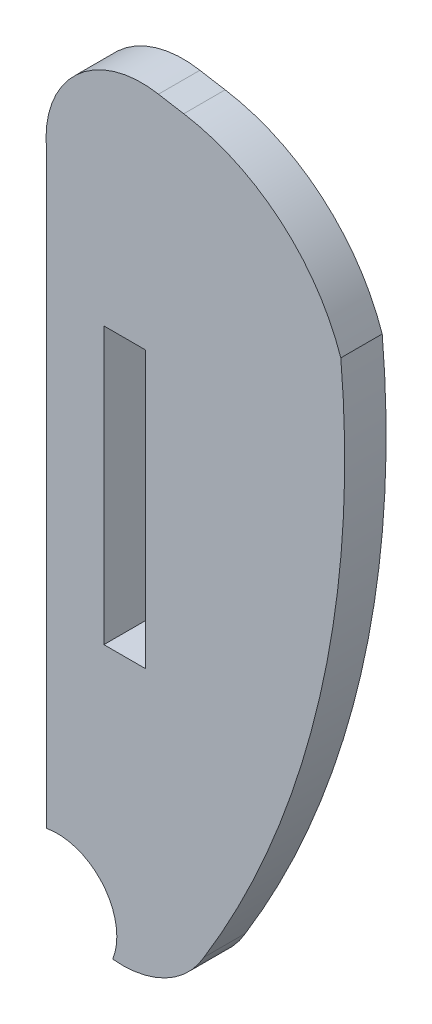
ISO-10303-21;
HEADER;
FILE_DESCRIPTION(('STEP AP214'),'2;1');
FILE_NAME('part.step','',(''),(''),'','','');
FILE_SCHEMA(('AUTOMOTIVE_DESIGN { 1 0 10303 214 1 1 1 1 }'));
ENDSEC;
DATA;
#1=APPLICATION_CONTEXT('core data for automotive mechanical design processes');
#2=APPLICATION_PROTOCOL_DEFINITION('international standard','automotive_design',2000,#1);
#3=PRODUCT_CONTEXT('',#1,'mechanical');
#4=PRODUCT('Part','Part','',(#3));
#5=PRODUCT_RELATED_PRODUCT_CATEGORY('part','',(#4));
#6=PRODUCT_DEFINITION_FORMATION('','',#4);
#7=PRODUCT_DEFINITION_CONTEXT('part definition',#1,'design');
#8=PRODUCT_DEFINITION('design','',#6,#7);
#9=PRODUCT_DEFINITION_SHAPE('','',#8);
#10=(LENGTH_UNIT() NAMED_UNIT(*) SI_UNIT(.MILLI.,.METRE.));
#11=(NAMED_UNIT(*) PLANE_ANGLE_UNIT() SI_UNIT($,.RADIAN.));
#12=(NAMED_UNIT(*) SI_UNIT($,.STERADIAN.) SOLID_ANGLE_UNIT());
#13=UNCERTAINTY_MEASURE_WITH_UNIT(LENGTH_MEASURE(1.E-05),#10,'distance_accuracy_value','');
#14=(GEOMETRIC_REPRESENTATION_CONTEXT(3) GLOBAL_UNCERTAINTY_ASSIGNED_CONTEXT((#13)) GLOBAL_UNIT_ASSIGNED_CONTEXT((#10,
#11,#12)) REPRESENTATION_CONTEXT('',''));
#15=CARTESIAN_POINT('',(0.,0.,0.));
#16=DIRECTION('',(0.,0.,1.));
#17=DIRECTION('',(1.,0.,0.));
#18=AXIS2_PLACEMENT_3D('',#15,#16,#17);
#19=CARTESIAN_POINT('',(497.741185340463,92.0080241068079,3.));
#20=DIRECTION('',(0.,0.,-1.));
#21=DIRECTION('',(-1.,0.,0.));
#22=AXIS2_PLACEMENT_3D('',#19,#20,#21);
#23=PLANE('',#22);
#24=CARTESIAN_POINT('',(497.741185340463,92.0080241068079,3.));
#25=DIRECTION('',(0.,0.,1.));
#26=DIRECTION('',(-1.,0.,0.));
#27=AXIS2_PLACEMENT_3D('',#24,#25,#26);
#28=CIRCLE('',#27,6.9316538516134);
#29=CARTESIAN_POINT('',(498.958835762665,98.8318905011549,3.));
#30=VERTEX_POINT('',#29);
#31=CARTESIAN_POINT('',(490.859334315615,91.178595634675,3.));
#32=VERTEX_POINT('',#31);
#33=EDGE_CURVE('E165',#30,#32,#28,.T.);
#34=ORIENTED_EDGE('',*,*,#33,.T.);
#35=DIRECTION('',(0.,-1.,0.));
#36=VECTOR('',#35,1.);
#37=CARTESIAN_POINT('',(490.859334315615,48.7114452312453,3.));
#38=LINE('',#37,#36);
#39=CARTESIAN_POINT('',(490.859334315615,48.7114452312453,3.));
#40=VERTEX_POINT('',#39);
#41=EDGE_CURVE('E168',#32,#40,#38,.T.);
#42=ORIENTED_EDGE('',*,*,#41,.T.);
#43=CARTESIAN_POINT('',(491.625741730672,44.4653812051788,3.));
#44=DIRECTION('',(0.,0.,-1.));
#45=DIRECTION('',(-1.,0.,0.));
#46=AXIS2_PLACEMENT_3D('',#43,#44,#45);
#47=CIRCLE('',#46,4.31467728101534);
#48=CARTESIAN_POINT('',(495.646031752368,42.8989495339077,3.));
#49=VERTEX_POINT('',#48);
#50=EDGE_CURVE('E170',#40,#49,#47,.T.);
#51=ORIENTED_EDGE('',*,*,#50,.T.);
#52=CARTESIAN_POINT('',(496.334649050729,49.6575672711019,3.));
#53=DIRECTION('',(0.,0.,1.));
#54=DIRECTION('',(-1.,0.,0.));
#55=AXIS2_PLACEMENT_3D('',#52,#53,#54);
#56=CIRCLE('',#55,6.79360784128132);
#57=CARTESIAN_POINT('',(502.248398483044,46.3138156127232,3.));
#58=VERTEX_POINT('',#57);
#59=EDGE_CURVE('E172',#49,#58,#56,.T.);
#60=ORIENTED_EDGE('',*,*,#59,.T.);
#61=CARTESIAN_POINT('',(442.757077911992,82.6163671217819,3.));
#62=DIRECTION('',(0.,0.,1.));
#63=DIRECTION('',(1.,0.,0.));
#64=AXIS2_PLACEMENT_3D('',#61,#62,#63);
#65=CIRCLE('',#64,69.6928437456493);
#66=CARTESIAN_POINT('',(512.167074898296,88.888909486464,3.));
#67=VERTEX_POINT('',#66);
#68=EDGE_CURVE('E174',#58,#67,#65,.T.);
#69=ORIENTED_EDGE('',*,*,#68,.T.);
#70=CARTESIAN_POINT('',(498.469280705011,84.2428476662427,3.));
#71=DIRECTION('',(0.,0.,1.));
#72=DIRECTION('',(-1.,0.,0.));
#73=AXIS2_PLACEMENT_3D('',#70,#71,#72);
#74=CIRCLE('',#73,14.4642820837718);
#75=CARTESIAN_POINT('',(500.789492390664,98.519824724874,3.));
#76=VERTEX_POINT('',#75);
#77=EDGE_CURVE('E176',#67,#76,#74,.T.);
#78=ORIENTED_EDGE('',*,*,#77,.T.);
#79=CARTESIAN_POINT('',(520.038660836481,216.965886348486,3.));
#80=DIRECTION('',(0.,0.,-1.));
#81=DIRECTION('',(-1.,0.,0.));
#82=AXIS2_PLACEMENT_3D('',#79,#80,#81);
#83=CIRCLE('',#82,120.);
#84=EDGE_CURVE('E178',#76,#30,#83,.T.);
#85=ORIENTED_EDGE('',*,*,#84,.T.);
#86=EDGE_LOOP('',(#34,#42,#51,#60,#69,#78,#85));
#87=FACE_BOUND('',#86,.T.);
#88=DIRECTION('',(0.,1.,0.));
#89=VECTOR('',#88,1.);
#90=CARTESIAN_POINT('',(498.003228355616,82.3139300559887,3.));
#91=LINE('',#90,#89);
#92=CARTESIAN_POINT('',(498.003228355616,62.3139300559887,3.));
#93=VERTEX_POINT('',#92);
#94=CARTESIAN_POINT('',(498.003228355616,82.3139300559887,3.));
#95=VERTEX_POINT('',#94);
#96=EDGE_CURVE('E130',#93,#95,#91,.T.);
#97=ORIENTED_EDGE('',*,*,#96,.F.);
#98=DIRECTION('',(1.,0.,0.));
#99=VECTOR('',#98,1.);
#100=CARTESIAN_POINT('',(498.003228355616,62.3139300559887,3.));
#101=LINE('',#100,#99);
#102=CARTESIAN_POINT('',(495.003228355616,62.3139300559887,3.));
#103=VERTEX_POINT('',#102);
#104=EDGE_CURVE('E145',#103,#93,#101,.T.);
#105=ORIENTED_EDGE('',*,*,#104,.F.);
#106=DIRECTION('',(0.,-1.,0.));
#107=VECTOR('',#106,1.);
#108=CARTESIAN_POINT('',(495.003228355616,62.3139300559887,3.));
#109=LINE('',#108,#107);
#110=CARTESIAN_POINT('',(495.003228355616,82.3139300559887,3.));
#111=VERTEX_POINT('',#110);
#112=EDGE_CURVE('E143',#111,#103,#109,.T.);
#113=ORIENTED_EDGE('',*,*,#112,.F.);
#114=DIRECTION('',(-1.,0.,0.));
#115=VECTOR('',#114,1.);
#116=CARTESIAN_POINT('',(495.003228355616,82.3139300559887,3.));
#117=LINE('',#116,#115);
#118=EDGE_CURVE('E141',#95,#111,#117,.T.);
#119=ORIENTED_EDGE('',*,*,#118,.F.);
#120=EDGE_LOOP('',(#97,#105,#113,#119));
#121=FACE_BOUND('',#120,.T.);
#122=ADVANCED_FACE('F32',(#87,#121),#23,.F.);
#123=CARTESIAN_POINT('',(497.741185340463,92.0080241068079,0.));
#124=DIRECTION('',(0.,0.,-1.));
#125=DIRECTION('',(-1.,0.,0.));
#126=AXIS2_PLACEMENT_3D('',#123,#124,#125);
#127=PLANE('',#126);
#128=CARTESIAN_POINT('',(497.741185340463,92.0080241068079,0.));
#129=DIRECTION('',(0.,0.,1.));
#130=DIRECTION('',(-1.,0.,0.));
#131=AXIS2_PLACEMENT_3D('',#128,#129,#130);
#132=CIRCLE('',#131,6.9316538516134);
#133=CARTESIAN_POINT('',(498.958835762665,98.8318905011549,0.));
#134=VERTEX_POINT('',#133);
#135=CARTESIAN_POINT('',(490.859334315615,91.178595634675,0.));
#136=VERTEX_POINT('',#135);
#137=EDGE_CURVE('E131',#134,#136,#132,.T.);
#138=ORIENTED_EDGE('',*,*,#137,.F.);
#139=CARTESIAN_POINT('',(520.038660836481,216.965886348486,0.));
#140=DIRECTION('',(0.,0.,-1.));
#141=DIRECTION('',(-1.,0.,0.));
#142=AXIS2_PLACEMENT_3D('',#139,#140,#141);
#143=CIRCLE('',#142,120.);
#144=CARTESIAN_POINT('',(500.789492390664,98.519824724874,0.));
#145=VERTEX_POINT('',#144);
#146=EDGE_CURVE('E163',#145,#134,#143,.T.);
#147=ORIENTED_EDGE('',*,*,#146,.F.);
#148=CARTESIAN_POINT('',(498.469280705011,84.2428476662427,0.));
#149=DIRECTION('',(0.,0.,1.));
#150=DIRECTION('',(-1.,0.,0.));
#151=AXIS2_PLACEMENT_3D('',#148,#149,#150);
#152=CIRCLE('',#151,14.4642820837718);
#153=CARTESIAN_POINT('',(512.167074898296,88.888909486464,0.));
#154=VERTEX_POINT('',#153);
#155=EDGE_CURVE('E161',#154,#145,#152,.T.);
#156=ORIENTED_EDGE('',*,*,#155,.F.);
#157=CARTESIAN_POINT('',(442.757077911992,82.6163671217819,0.));
#158=DIRECTION('',(0.,0.,1.));
#159=DIRECTION('',(1.,0.,0.));
#160=AXIS2_PLACEMENT_3D('',#157,#158,#159);
#161=CIRCLE('',#160,69.6928437456493);
#162=CARTESIAN_POINT('',(502.248398483044,46.3138156127232,0.));
#163=VERTEX_POINT('',#162);
#164=EDGE_CURVE('E159',#163,#154,#161,.T.);
#165=ORIENTED_EDGE('',*,*,#164,.F.);
#166=CARTESIAN_POINT('',(496.334649050729,49.6575672711019,0.));
#167=DIRECTION('',(0.,0.,1.));
#168=DIRECTION('',(-1.,0.,0.));
#169=AXIS2_PLACEMENT_3D('',#166,#167,#168);
#170=CIRCLE('',#169,6.79360784128132);
#171=CARTESIAN_POINT('',(495.646031752368,42.8989495339077,0.));
#172=VERTEX_POINT('',#171);
#173=EDGE_CURVE('E157',#172,#163,#170,.T.);
#174=ORIENTED_EDGE('',*,*,#173,.F.);
#175=CARTESIAN_POINT('',(491.625741730672,44.4653812051788,0.));
#176=DIRECTION('',(0.,0.,-1.));
#177=DIRECTION('',(-1.,0.,0.));
#178=AXIS2_PLACEMENT_3D('',#175,#176,#177);
#179=CIRCLE('',#178,4.31467728101534);
#180=CARTESIAN_POINT('',(490.859334315615,48.7114452312453,0.));
#181=VERTEX_POINT('',#180);
#182=EDGE_CURVE('E155',#181,#172,#179,.T.);
#183=ORIENTED_EDGE('',*,*,#182,.F.);
#184=DIRECTION('',(0.,-1.,0.));
#185=VECTOR('',#184,1.);
#186=CARTESIAN_POINT('',(490.859334315615,48.7114452312453,0.));
#187=LINE('',#186,#185);
#188=EDGE_CURVE('E153',#136,#181,#187,.T.);
#189=ORIENTED_EDGE('',*,*,#188,.F.);
#190=EDGE_LOOP('',(#138,#147,#156,#165,#174,#183,#189));
#191=FACE_BOUND('',#190,.T.);
#192=DIRECTION('',(1.,0.,0.));
#193=VECTOR('',#192,1.);
#194=CARTESIAN_POINT('',(498.003228355616,62.3139300559887,0.));
#195=LINE('',#194,#193);
#196=CARTESIAN_POINT('',(495.003228355616,62.3139300559887,0.));
#197=VERTEX_POINT('',#196);
#198=CARTESIAN_POINT('',(498.003228355616,62.3139300559887,0.));
#199=VERTEX_POINT('',#198);
#200=EDGE_CURVE('E135',#197,#199,#195,.T.);
#201=ORIENTED_EDGE('',*,*,#200,.T.);
#202=DIRECTION('',(0.,1.,0.));
#203=VECTOR('',#202,1.);
#204=CARTESIAN_POINT('',(498.003228355616,82.3139300559887,0.));
#205=LINE('',#204,#203);
#206=CARTESIAN_POINT('',(498.003228355616,82.3139300559887,0.));
#207=VERTEX_POINT('',#206);
#208=EDGE_CURVE('E55',#199,#207,#205,.T.);
#209=ORIENTED_EDGE('',*,*,#208,.T.);
#210=DIRECTION('',(-1.,0.,0.));
#211=VECTOR('',#210,1.);
#212=CARTESIAN_POINT('',(495.003228355616,82.3139300559887,0.));
#213=LINE('',#212,#211);
#214=CARTESIAN_POINT('',(495.003228355616,82.3139300559887,0.));
#215=VERTEX_POINT('',#214);
#216=EDGE_CURVE('E117',#207,#215,#213,.T.);
#217=ORIENTED_EDGE('',*,*,#216,.T.);
#218=DIRECTION('',(0.,-1.,0.));
#219=VECTOR('',#218,1.);
#220=CARTESIAN_POINT('',(495.003228355616,62.3139300559887,0.));
#221=LINE('',#220,#219);
#222=EDGE_CURVE('E126',#215,#197,#221,.T.);
#223=ORIENTED_EDGE('',*,*,#222,.T.);
#224=EDGE_LOOP('',(#201,#209,#217,#223));
#225=FACE_BOUND('',#224,.T.);
#226=ADVANCED_FACE('F134',(#191,#225),#127,.T.);
#227=CARTESIAN_POINT('',(497.741185340463,92.0080241068079,3.));
#228=DIRECTION('',(0.,0.,-1.));
#229=DIRECTION('',(-1.,0.,0.));
#230=AXIS2_PLACEMENT_3D('',#227,#228,#229);
#231=CYLINDRICAL_SURFACE('',#230,6.9316538516134);
#232=ORIENTED_EDGE('',*,*,#137,.T.);
#233=DIRECTION('',(0.,0.,-1.));
#234=VECTOR('',#233,1.);
#235=CARTESIAN_POINT('',(490.859334315615,91.178595634675,3.));
#236=LINE('',#235,#234);
#237=EDGE_CURVE('E11',#32,#136,#236,.T.);
#238=ORIENTED_EDGE('',*,*,#237,.F.);
#239=ORIENTED_EDGE('',*,*,#33,.F.);
#240=DIRECTION('',(0.,0.,-1.));
#241=VECTOR('',#240,1.);
#242=CARTESIAN_POINT('',(498.958835762665,98.8318905011549,3.));
#243=LINE('',#242,#241);
#244=EDGE_CURVE('E180',#30,#134,#243,.T.);
#245=ORIENTED_EDGE('',*,*,#244,.T.);
#246=EDGE_LOOP('',(#232,#238,#239,#245));
#247=FACE_BOUND('',#246,.T.);
#248=ADVANCED_FACE('F34',(#247),#231,.T.);
#249=CARTESIAN_POINT('',(490.859334315615,48.7114452312453,3.));
#250=DIRECTION('',(1.,0.,0.));
#251=DIRECTION('',(0.,1.,0.));
#252=AXIS2_PLACEMENT_3D('',#249,#250,#251);
#253=PLANE('',#252);
#254=ORIENTED_EDGE('',*,*,#188,.T.);
#255=DIRECTION('',(0.,0.,-1.));
#256=VECTOR('',#255,1.);
#257=CARTESIAN_POINT('',(490.859334315615,48.7114452312453,3.));
#258=LINE('',#257,#256);
#259=EDGE_CURVE('E40',#40,#181,#258,.T.);
#260=ORIENTED_EDGE('',*,*,#259,.F.);
#261=ORIENTED_EDGE('',*,*,#41,.F.);
#262=ORIENTED_EDGE('',*,*,#237,.T.);
#263=EDGE_LOOP('',(#254,#260,#261,#262));
#264=FACE_BOUND('',#263,.T.);
#265=ADVANCED_FACE('F221',(#264),#253,.F.);
#266=CARTESIAN_POINT('',(491.625741730672,44.4653812051788,3.));
#267=DIRECTION('',(0.,0.,-1.));
#268=DIRECTION('',(-1.,0.,0.));
#269=AXIS2_PLACEMENT_3D('',#266,#267,#268);
#270=CYLINDRICAL_SURFACE('',#269,4.31467728101534);
#271=ORIENTED_EDGE('',*,*,#182,.T.);
#272=DIRECTION('',(0.,0.,-1.));
#273=VECTOR('',#272,1.);
#274=CARTESIAN_POINT('',(495.646031752368,42.8989495339077,3.));
#275=LINE('',#274,#273);
#276=EDGE_CURVE('E192',#49,#172,#275,.T.);
#277=ORIENTED_EDGE('',*,*,#276,.F.);
#278=ORIENTED_EDGE('',*,*,#50,.F.);
#279=ORIENTED_EDGE('',*,*,#259,.T.);
#280=EDGE_LOOP('',(#271,#277,#278,#279));
#281=FACE_BOUND('',#280,.T.);
#282=ADVANCED_FACE('F199',(#281),#270,.F.);
#283=CARTESIAN_POINT('',(496.334649050729,49.6575672711019,3.));
#284=DIRECTION('',(0.,0.,-1.));
#285=DIRECTION('',(-1.,0.,0.));
#286=AXIS2_PLACEMENT_3D('',#283,#284,#285);
#287=CYLINDRICAL_SURFACE('',#286,6.79360784128132);
#288=ORIENTED_EDGE('',*,*,#173,.T.);
#289=DIRECTION('',(0.,0.,-1.));
#290=VECTOR('',#289,1.);
#291=CARTESIAN_POINT('',(502.248398483044,46.3138156127232,3.));
#292=LINE('',#291,#290);
#293=EDGE_CURVE('E189',#58,#163,#292,.T.);
#294=ORIENTED_EDGE('',*,*,#293,.F.);
#295=ORIENTED_EDGE('',*,*,#59,.F.);
#296=ORIENTED_EDGE('',*,*,#276,.T.);
#297=EDGE_LOOP('',(#288,#294,#295,#296));
#298=FACE_BOUND('',#297,.T.);
#299=ADVANCED_FACE('F209',(#298),#287,.T.);
#300=CARTESIAN_POINT('',(442.757077911992,82.6163671217819,3.));
#301=DIRECTION('',(0.,0.,-1.));
#302=DIRECTION('',(-1.,0.,0.));
#303=AXIS2_PLACEMENT_3D('',#300,#301,#302);
#304=CYLINDRICAL_SURFACE('',#303,69.6928437456493);
#305=ORIENTED_EDGE('',*,*,#164,.T.);
#306=DIRECTION('',(0.,0.,-1.));
#307=VECTOR('',#306,1.);
#308=CARTESIAN_POINT('',(512.167074898296,88.888909486464,3.));
#309=LINE('',#308,#307);
#310=EDGE_CURVE('E186',#67,#154,#309,.T.);
#311=ORIENTED_EDGE('',*,*,#310,.F.);
#312=ORIENTED_EDGE('',*,*,#68,.F.);
#313=ORIENTED_EDGE('',*,*,#293,.T.);
#314=EDGE_LOOP('',(#305,#311,#312,#313));
#315=FACE_BOUND('',#314,.T.);
#316=ADVANCED_FACE('F213',(#315),#304,.T.);
#317=CARTESIAN_POINT('',(498.469280705011,84.2428476662427,3.));
#318=DIRECTION('',(0.,0.,-1.));
#319=DIRECTION('',(-1.,0.,0.));
#320=AXIS2_PLACEMENT_3D('',#317,#318,#319);
#321=CYLINDRICAL_SURFACE('',#320,14.4642820837718);
#322=ORIENTED_EDGE('',*,*,#155,.T.);
#323=DIRECTION('',(0.,0.,-1.));
#324=VECTOR('',#323,1.);
#325=CARTESIAN_POINT('',(500.789492390664,98.519824724874,3.));
#326=LINE('',#325,#324);
#327=EDGE_CURVE('E183',#76,#145,#326,.T.);
#328=ORIENTED_EDGE('',*,*,#327,.F.);
#329=ORIENTED_EDGE('',*,*,#77,.F.);
#330=ORIENTED_EDGE('',*,*,#310,.T.);
#331=EDGE_LOOP('',(#322,#328,#329,#330));
#332=FACE_BOUND('',#331,.T.);
#333=ADVANCED_FACE('F229',(#332),#321,.T.);
#334=CARTESIAN_POINT('',(520.038660836481,216.965886348486,3.));
#335=DIRECTION('',(0.,0.,-1.));
#336=DIRECTION('',(-1.,0.,0.));
#337=AXIS2_PLACEMENT_3D('',#334,#335,#336);
#338=CYLINDRICAL_SURFACE('',#337,120.);
#339=ORIENTED_EDGE('',*,*,#146,.T.);
#340=ORIENTED_EDGE('',*,*,#244,.F.);
#341=ORIENTED_EDGE('',*,*,#84,.F.);
#342=ORIENTED_EDGE('',*,*,#327,.T.);
#343=EDGE_LOOP('',(#339,#340,#341,#342));
#344=FACE_BOUND('',#343,.T.);
#345=ADVANCED_FACE('F226',(#344),#338,.F.);
#346=CARTESIAN_POINT('',(498.003228355616,82.3139300559887,3.));
#347=DIRECTION('',(-1.,0.,0.));
#348=DIRECTION('',(0.,0.,1.));
#349=AXIS2_PLACEMENT_3D('',#346,#347,#348);
#350=PLANE('',#349);
#351=ORIENTED_EDGE('',*,*,#208,.F.);
#352=DIRECTION('',(0.,0.,-1.));
#353=VECTOR('',#352,1.);
#354=CARTESIAN_POINT('',(498.003228355616,62.3139300559887,3.));
#355=LINE('',#354,#353);
#356=EDGE_CURVE('E147',#93,#199,#355,.T.);
#357=ORIENTED_EDGE('',*,*,#356,.F.);
#358=ORIENTED_EDGE('',*,*,#96,.T.);
#359=DIRECTION('',(0.,0.,-1.));
#360=VECTOR('',#359,1.);
#361=CARTESIAN_POINT('',(498.003228355616,82.3139300559887,3.));
#362=LINE('',#361,#360);
#363=EDGE_CURVE('E119',#95,#207,#362,.T.);
#364=ORIENTED_EDGE('',*,*,#363,.T.);
#365=EDGE_LOOP('',(#351,#357,#358,#364));
#366=FACE_BOUND('',#365,.T.);
#367=ADVANCED_FACE('F128',(#366),#350,.T.);
#368=CARTESIAN_POINT('',(495.003228355616,82.3139300559887,3.));
#369=DIRECTION('',(0.,-1.,0.));
#370=DIRECTION('',(0.,0.,-1.));
#371=AXIS2_PLACEMENT_3D('',#368,#369,#370);
#372=PLANE('',#371);
#373=ORIENTED_EDGE('',*,*,#216,.F.);
#374=ORIENTED_EDGE('',*,*,#363,.F.);
#375=ORIENTED_EDGE('',*,*,#118,.T.);
#376=DIRECTION('',(0.,0.,-1.));
#377=VECTOR('',#376,1.);
#378=CARTESIAN_POINT('',(495.003228355616,82.3139300559887,3.));
#379=LINE('',#378,#377);
#380=EDGE_CURVE('E122',#111,#215,#379,.T.);
#381=ORIENTED_EDGE('',*,*,#380,.T.);
#382=EDGE_LOOP('',(#373,#374,#375,#381));
#383=FACE_BOUND('',#382,.T.);
#384=ADVANCED_FACE('F118',(#383),#372,.T.);
#385=CARTESIAN_POINT('',(495.003228355616,62.3139300559887,3.));
#386=DIRECTION('',(1.,0.,0.));
#387=DIRECTION('',(0.,0.,-1.));
#388=AXIS2_PLACEMENT_3D('',#385,#386,#387);
#389=PLANE('',#388);
#390=ORIENTED_EDGE('',*,*,#222,.F.);
#391=ORIENTED_EDGE('',*,*,#380,.F.);
#392=ORIENTED_EDGE('',*,*,#112,.T.);
#393=DIRECTION('',(0.,0.,-1.));
#394=VECTOR('',#393,1.);
#395=CARTESIAN_POINT('',(495.003228355616,62.3139300559887,3.));
#396=LINE('',#395,#394);
#397=EDGE_CURVE('E47',#103,#197,#396,.T.);
#398=ORIENTED_EDGE('',*,*,#397,.T.);
#399=EDGE_LOOP('',(#390,#391,#392,#398));
#400=FACE_BOUND('',#399,.T.);
#401=ADVANCED_FACE('F249',(#400),#389,.T.);
#402=CARTESIAN_POINT('',(498.003228355616,62.3139300559887,3.));
#403=DIRECTION('',(0.,1.,0.));
#404=DIRECTION('',(0.,0.,1.));
#405=AXIS2_PLACEMENT_3D('',#402,#403,#404);
#406=PLANE('',#405);
#407=ORIENTED_EDGE('',*,*,#200,.F.);
#408=ORIENTED_EDGE('',*,*,#397,.F.);
#409=ORIENTED_EDGE('',*,*,#104,.T.);
#410=ORIENTED_EDGE('',*,*,#356,.T.);
#411=EDGE_LOOP('',(#407,#408,#409,#410));
#412=FACE_BOUND('',#411,.T.);
#413=ADVANCED_FACE('F252',(#412),#406,.T.);
#414=CLOSED_SHELL('',(#122,#226,#248,#265,#282,#299,#316,#333,#345,#367,#384,#401,#413));
#415=MANIFOLD_SOLID_BREP('B2',#414);
#416=ADVANCED_BREP_SHAPE_REPRESENTATION('',(#18,#415),#14);
#417=SHAPE_DEFINITION_REPRESENTATION(#9,#416);
ENDSEC;
END-ISO-10303-21;
